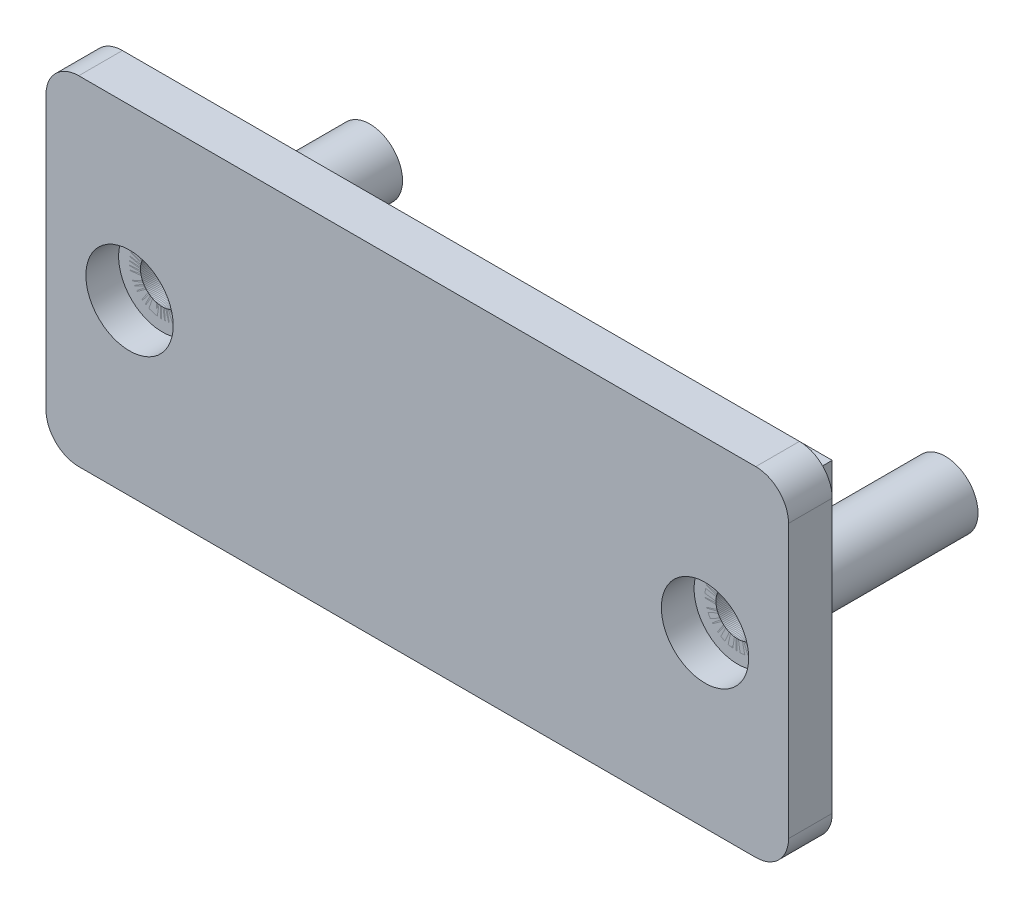
ISO-10303-21;
HEADER;
FILE_DESCRIPTION(('STEP AP214'),'2;1');
FILE_NAME('part.step','',(''),(''),'','','');
FILE_SCHEMA(('AUTOMOTIVE_DESIGN { 1 0 10303 214 1 1 1 1 }'));
ENDSEC;
DATA;
#1=APPLICATION_CONTEXT('core data for automotive mechanical design processes');
#2=APPLICATION_PROTOCOL_DEFINITION('international standard','automotive_design',2000,#1);
#3=PRODUCT_CONTEXT('',#1,'mechanical');
#4=PRODUCT('Part','Part','',(#3));
#5=PRODUCT_RELATED_PRODUCT_CATEGORY('part','',(#4));
#6=PRODUCT_DEFINITION_FORMATION('','',#4);
#7=PRODUCT_DEFINITION_CONTEXT('part definition',#1,'design');
#8=PRODUCT_DEFINITION('design','',#6,#7);
#9=PRODUCT_DEFINITION_SHAPE('','',#8);
#10=(LENGTH_UNIT() NAMED_UNIT(*) SI_UNIT(.MILLI.,.METRE.));
#11=(NAMED_UNIT(*) PLANE_ANGLE_UNIT() SI_UNIT($,.RADIAN.));
#12=(NAMED_UNIT(*) SI_UNIT($,.STERADIAN.) SOLID_ANGLE_UNIT());
#13=UNCERTAINTY_MEASURE_WITH_UNIT(LENGTH_MEASURE(1.E-05),#10,'distance_accuracy_value','');
#14=(GEOMETRIC_REPRESENTATION_CONTEXT(3) GLOBAL_UNCERTAINTY_ASSIGNED_CONTEXT((#13)) GLOBAL_UNIT_ASSIGNED_CONTEXT((#10,
#11,#12)) REPRESENTATION_CONTEXT('',''));
#15=CARTESIAN_POINT('',(0.,0.,0.));
#16=DIRECTION('',(0.,0.,1.));
#17=DIRECTION('',(1.,0.,0.));
#18=AXIS2_PLACEMENT_3D('',#15,#16,#17);
#19=CARTESIAN_POINT('',(-26.35,0.,26.));
#20=DIRECTION('',(0.,0.,-1.));
#21=DIRECTION('',(-1.,0.,0.));
#22=AXIS2_PLACEMENT_3D('',#19,#20,#21);
#23=CYLINDRICAL_SURFACE('',#22,2.);
#24=CARTESIAN_POINT('',(-26.35,0.,-8.));
#25=DIRECTION('',(0.,0.,1.));
#26=DIRECTION('',(1.,0.,0.));
#27=AXIS2_PLACEMENT_3D('',#24,#25,#26);
#28=CIRCLE('',#27,2.);
#29=CARTESIAN_POINT('',(-28.35,0.,-8.));
#30=VERTEX_POINT('',#29);
#31=EDGE_CURVE('E196',#30,#30,#28,.F.);
#32=CARTESIAN_POINT('',(-26.35,0.,-3.));
#33=DIRECTION('',(0.,0.,1.));
#34=DIRECTION('',(1.,0.,0.));
#35=AXIS2_PLACEMENT_3D('',#32,#33,#34);
#36=CIRCLE('',#35,2.);
#37=CARTESIAN_POINT('',(-28.35,0.,-3.));
#38=VERTEX_POINT('',#37);
#39=EDGE_CURVE('E302',#38,#38,#36,.T.);
#40=CARTESIAN_POINT('',(-28.35,0.,-8.));
#41=CARTESIAN_POINT('',(-28.35,0.,-7.94791666666667));
#42=CARTESIAN_POINT('',(-28.35,0.,-7.89583333333334));
#43=CARTESIAN_POINT('',(-28.35,0.,-7.79166666666667));
#44=CARTESIAN_POINT('',(-28.35,0.,-7.73958333333333));
#45=CARTESIAN_POINT('',(-28.35,0.,-7.63541666666667));
#46=CARTESIAN_POINT('',(-28.35,0.,-7.58333333333333));
#47=CARTESIAN_POINT('',(-28.35,0.,-7.47916666666666));
#48=CARTESIAN_POINT('',(-28.35,0.,-7.42708333333333));
#49=CARTESIAN_POINT('',(-28.35,0.,-7.32291666666667));
#50=CARTESIAN_POINT('',(-28.35,0.,-7.27083333333333));
#51=CARTESIAN_POINT('',(-28.35,0.,-7.16666666666667));
#52=CARTESIAN_POINT('',(-28.35,0.,-7.11458333333333));
#53=CARTESIAN_POINT('',(-28.35,0.,-7.01041666666667));
#54=CARTESIAN_POINT('',(-28.35,0.,-6.95833333333333));
#55=CARTESIAN_POINT('',(-28.35,0.,-6.85416666666666));
#56=CARTESIAN_POINT('',(-28.35,0.,-6.80208333333333));
#57=CARTESIAN_POINT('',(-28.35,0.,-6.69791666666667));
#58=CARTESIAN_POINT('',(-28.35,0.,-6.64583333333333));
#59=CARTESIAN_POINT('',(-28.35,0.,-6.54166666666667));
#60=CARTESIAN_POINT('',(-28.35,0.,-6.48958333333333));
#61=CARTESIAN_POINT('',(-28.35,0.,-6.38541666666666));
#62=CARTESIAN_POINT('',(-28.35,0.,-6.33333333333333));
#63=CARTESIAN_POINT('',(-28.35,0.,-6.22916666666666));
#64=CARTESIAN_POINT('',(-28.35,0.,-6.17708333333333));
#65=CARTESIAN_POINT('',(-28.35,0.,-6.07291666666667));
#66=CARTESIAN_POINT('',(-28.35,0.,-6.02083333333333));
#67=CARTESIAN_POINT('',(-28.35,0.,-5.91666666666667));
#68=CARTESIAN_POINT('',(-28.35,0.,-5.86458333333333));
#69=CARTESIAN_POINT('',(-28.35,0.,-5.76041666666666));
#70=CARTESIAN_POINT('',(-28.35,0.,-5.70833333333333));
#71=CARTESIAN_POINT('',(-28.35,0.,-5.60416666666666));
#72=CARTESIAN_POINT('',(-28.35,0.,-5.55208333333333));
#73=CARTESIAN_POINT('',(-28.35,0.,-5.44791666666667));
#74=CARTESIAN_POINT('',(-28.35,0.,-5.39583333333333));
#75=CARTESIAN_POINT('',(-28.35,0.,-5.29166666666667));
#76=CARTESIAN_POINT('',(-28.35,0.,-5.23958333333333));
#77=CARTESIAN_POINT('',(-28.35,0.,-5.13541666666667));
#78=CARTESIAN_POINT('',(-28.35,0.,-5.08333333333333));
#79=CARTESIAN_POINT('',(-28.35,0.,-4.97916666666667));
#80=CARTESIAN_POINT('',(-28.35,0.,-4.92708333333333));
#81=CARTESIAN_POINT('',(-28.35,0.,-4.82291666666667));
#82=CARTESIAN_POINT('',(-28.35,0.,-4.77083333333333));
#83=CARTESIAN_POINT('',(-28.35,0.,-4.66666666666667));
#84=CARTESIAN_POINT('',(-28.35,0.,-4.61458333333333));
#85=CARTESIAN_POINT('',(-28.35,0.,-4.51041666666667));
#86=CARTESIAN_POINT('',(-28.35,0.,-4.45833333333333));
#87=CARTESIAN_POINT('',(-28.35,0.,-4.35416666666667));
#88=CARTESIAN_POINT('',(-28.35,0.,-4.30208333333333));
#89=CARTESIAN_POINT('',(-28.35,0.,-4.19791666666667));
#90=CARTESIAN_POINT('',(-28.35,0.,-4.14583333333333));
#91=CARTESIAN_POINT('',(-28.35,0.,-4.04166666666667));
#92=CARTESIAN_POINT('',(-28.35,0.,-3.98958333333333));
#93=CARTESIAN_POINT('',(-28.35,0.,-3.88541666666667));
#94=CARTESIAN_POINT('',(-28.35,0.,-3.83333333333333));
#95=CARTESIAN_POINT('',(-28.35,0.,-3.72916666666667));
#96=CARTESIAN_POINT('',(-28.35,0.,-3.67708333333333));
#97=CARTESIAN_POINT('',(-28.35,0.,-3.57291666666667));
#98=CARTESIAN_POINT('',(-28.35,0.,-3.52083333333333));
#99=CARTESIAN_POINT('',(-28.35,0.,-3.41666666666667));
#100=CARTESIAN_POINT('',(-28.35,0.,-3.36458333333333));
#101=CARTESIAN_POINT('',(-28.35,0.,-3.26041666666667));
#102=CARTESIAN_POINT('',(-28.35,0.,-3.20833333333333));
#103=CARTESIAN_POINT('',(-28.35,0.,-3.10416666666667));
#104=CARTESIAN_POINT('',(-28.35,0.,-3.05208333333333));
#105=CARTESIAN_POINT('',(-28.35,0.,-3.));
#106=B_SPLINE_CURVE_WITH_KNOTS('',3,(#40,#41,#42,#43,#44,#45,#46,#47,#48,#49,#50,#51,#52,#53,
#54,#55,#56,#57,#58,#59,#60,#61,#62,#63,#64,#65,#66,#67,#68,#69,#70,#71,#72,#73,#74,#75,#76,#77,
#78,#79,#80,#81,#82,#83,#84,#85,#86,#87,#88,#89,#90,#91,#92,#93,#94,#95,#96,#97,#98,#99,#100,
#101,#102,#103,#104,#105),.UNSPECIFIED.,.F.,.F.,(4,2,2,2,2,2,2,2,2,2,2,2,2,2,2,2,2,2,2,2,2,2,2,
2,2,2,2,2,2,2,2,2,4),(0.,0.156249999999997,0.3125,0.468750000000004,0.625000000000001,
0.781249999999997,0.937500000000001,1.09375,1.25,1.40625,1.5625,1.71875,1.875,2.03125,2.1875,
2.34375000000001,2.5,2.65625,2.8125,2.96875,3.125,3.28125,3.4375,3.59375,3.75,3.90625,4.0625,
4.21875,4.375,4.53125,4.6875,4.84375,5.),.UNSPECIFIED.);
#107=EDGE_CURVE('BSEAM80',#30,#38,#106,.T.);
#108=ORIENTED_EDGE('',*,*,#31,.T.);
#109=ORIENTED_EDGE('',*,*,#39,.T.);
#110=ORIENTED_EDGE('',*,*,#107,.T.);
#111=ORIENTED_EDGE('',*,*,#107,.F.);
#112=EDGE_LOOP('',(#108,#110,#109,#111));
#113=FACE_BOUND('',#112,.T.);
#114=ADVANCED_FACE('F80',(#113),#23,.F.);
#115=CARTESIAN_POINT('',(26.35,0.,26.));
#116=DIRECTION('',(0.,0.,-1.));
#117=DIRECTION('',(-1.,0.,0.));
#118=AXIS2_PLACEMENT_3D('',#115,#116,#117);
#119=CYLINDRICAL_SURFACE('',#118,2.);
#120=CARTESIAN_POINT('',(26.35,0.,-8.));
#121=DIRECTION('',(0.,0.,1.));
#122=DIRECTION('',(1.,0.,0.));
#123=AXIS2_PLACEMENT_3D('',#120,#121,#122);
#124=CIRCLE('',#123,2.);
#125=CARTESIAN_POINT('',(24.35,0.,-8.));
#126=VERTEX_POINT('',#125);
#127=EDGE_CURVE('E84',#126,#126,#124,.F.);
#128=CARTESIAN_POINT('',(26.35,0.,-3.));
#129=DIRECTION('',(0.,0.,1.));
#130=DIRECTION('',(1.,0.,0.));
#131=AXIS2_PLACEMENT_3D('',#128,#129,#130);
#132=CIRCLE('',#131,2.);
#133=CARTESIAN_POINT('',(24.35,0.,-3.));
#134=VERTEX_POINT('',#133);
#135=EDGE_CURVE('E299',#134,#134,#132,.T.);
#136=CARTESIAN_POINT('',(24.35,0.,-8.));
#137=CARTESIAN_POINT('',(24.35,0.,-7.94791666666667));
#138=CARTESIAN_POINT('',(24.35,0.,-7.89583333333334));
#139=CARTESIAN_POINT('',(24.35,0.,-7.79166666666667));
#140=CARTESIAN_POINT('',(24.35,0.,-7.73958333333333));
#141=CARTESIAN_POINT('',(24.35,0.,-7.63541666666667));
#142=CARTESIAN_POINT('',(24.35,0.,-7.58333333333333));
#143=CARTESIAN_POINT('',(24.35,0.,-7.47916666666666));
#144=CARTESIAN_POINT('',(24.35,0.,-7.42708333333333));
#145=CARTESIAN_POINT('',(24.35,0.,-7.32291666666667));
#146=CARTESIAN_POINT('',(24.35,0.,-7.27083333333333));
#147=CARTESIAN_POINT('',(24.35,0.,-7.16666666666667));
#148=CARTESIAN_POINT('',(24.35,0.,-7.11458333333333));
#149=CARTESIAN_POINT('',(24.35,0.,-7.01041666666667));
#150=CARTESIAN_POINT('',(24.35,0.,-6.95833333333333));
#151=CARTESIAN_POINT('',(24.35,0.,-6.85416666666666));
#152=CARTESIAN_POINT('',(24.35,0.,-6.80208333333333));
#153=CARTESIAN_POINT('',(24.35,0.,-6.69791666666667));
#154=CARTESIAN_POINT('',(24.35,0.,-6.64583333333333));
#155=CARTESIAN_POINT('',(24.35,0.,-6.54166666666667));
#156=CARTESIAN_POINT('',(24.35,0.,-6.48958333333333));
#157=CARTESIAN_POINT('',(24.35,0.,-6.38541666666666));
#158=CARTESIAN_POINT('',(24.35,0.,-6.33333333333333));
#159=CARTESIAN_POINT('',(24.35,0.,-6.22916666666666));
#160=CARTESIAN_POINT('',(24.35,0.,-6.17708333333333));
#161=CARTESIAN_POINT('',(24.35,0.,-6.07291666666667));
#162=CARTESIAN_POINT('',(24.35,0.,-6.02083333333333));
#163=CARTESIAN_POINT('',(24.35,0.,-5.91666666666667));
#164=CARTESIAN_POINT('',(24.35,0.,-5.86458333333333));
#165=CARTESIAN_POINT('',(24.35,0.,-5.76041666666666));
#166=CARTESIAN_POINT('',(24.35,0.,-5.70833333333333));
#167=CARTESIAN_POINT('',(24.35,0.,-5.60416666666666));
#168=CARTESIAN_POINT('',(24.35,0.,-5.55208333333333));
#169=CARTESIAN_POINT('',(24.35,0.,-5.44791666666667));
#170=CARTESIAN_POINT('',(24.35,0.,-5.39583333333333));
#171=CARTESIAN_POINT('',(24.35,0.,-5.29166666666667));
#172=CARTESIAN_POINT('',(24.35,0.,-5.23958333333333));
#173=CARTESIAN_POINT('',(24.35,0.,-5.13541666666667));
#174=CARTESIAN_POINT('',(24.35,0.,-5.08333333333333));
#175=CARTESIAN_POINT('',(24.35,0.,-4.97916666666667));
#176=CARTESIAN_POINT('',(24.35,0.,-4.92708333333333));
#177=CARTESIAN_POINT('',(24.35,0.,-4.82291666666667));
#178=CARTESIAN_POINT('',(24.35,0.,-4.77083333333333));
#179=CARTESIAN_POINT('',(24.35,0.,-4.66666666666667));
#180=CARTESIAN_POINT('',(24.35,0.,-4.61458333333333));
#181=CARTESIAN_POINT('',(24.35,0.,-4.51041666666667));
#182=CARTESIAN_POINT('',(24.35,0.,-4.45833333333333));
#183=CARTESIAN_POINT('',(24.35,0.,-4.35416666666667));
#184=CARTESIAN_POINT('',(24.35,0.,-4.30208333333333));
#185=CARTESIAN_POINT('',(24.35,0.,-4.19791666666667));
#186=CARTESIAN_POINT('',(24.35,0.,-4.14583333333333));
#187=CARTESIAN_POINT('',(24.35,0.,-4.04166666666667));
#188=CARTESIAN_POINT('',(24.35,0.,-3.98958333333333));
#189=CARTESIAN_POINT('',(24.35,0.,-3.88541666666667));
#190=CARTESIAN_POINT('',(24.35,0.,-3.83333333333333));
#191=CARTESIAN_POINT('',(24.35,0.,-3.72916666666667));
#192=CARTESIAN_POINT('',(24.35,0.,-3.67708333333333));
#193=CARTESIAN_POINT('',(24.35,0.,-3.57291666666667));
#194=CARTESIAN_POINT('',(24.35,0.,-3.52083333333333));
#195=CARTESIAN_POINT('',(24.35,0.,-3.41666666666667));
#196=CARTESIAN_POINT('',(24.35,0.,-3.36458333333333));
#197=CARTESIAN_POINT('',(24.35,0.,-3.26041666666667));
#198=CARTESIAN_POINT('',(24.35,0.,-3.20833333333333));
#199=CARTESIAN_POINT('',(24.35,0.,-3.10416666666667));
#200=CARTESIAN_POINT('',(24.35,0.,-3.05208333333333));
#201=CARTESIAN_POINT('',(24.35,0.,-3.));
#202=B_SPLINE_CURVE_WITH_KNOTS('',3,(#136,#137,#138,#139,#140,#141,#142,#143,#144,#145,#146,
#147,#148,#149,#150,#151,#152,#153,#154,#155,#156,#157,#158,#159,#160,#161,#162,#163,#164,#165,
#166,#167,#168,#169,#170,#171,#172,#173,#174,#175,#176,#177,#178,#179,#180,#181,#182,#183,#184,
#185,#186,#187,#188,#189,#190,#191,#192,#193,#194,#195,#196,#197,#198,#199,#200,#201),
.UNSPECIFIED.,.F.,.F.,(4,2,2,2,2,2,2,2,2,2,2,2,2,2,2,2,2,2,2,2,2,2,2,2,2,2,2,2,2,2,2,2,4),(0.,
0.156249999999997,0.3125,0.468750000000004,0.625000000000001,0.781249999999997,
0.937500000000001,1.09375,1.25,1.40625,1.5625,1.71875,1.875,2.03125,2.1875,2.34375000000001,2.5,
2.65625,2.8125,2.96875,3.125,3.28125,3.4375,3.59375,3.75,3.90625,4.0625,4.21875,4.375,4.53125,
4.6875,4.84375,5.),.UNSPECIFIED.);
#203=EDGE_CURVE('BSEAM269',#126,#134,#202,.T.);
#204=ORIENTED_EDGE('',*,*,#127,.T.);
#205=ORIENTED_EDGE('',*,*,#135,.T.);
#206=ORIENTED_EDGE('',*,*,#203,.T.);
#207=ORIENTED_EDGE('',*,*,#203,.F.);
#208=EDGE_LOOP('',(#204,#206,#205,#207));
#209=FACE_BOUND('',#208,.T.);
#210=ADVANCED_FACE('F269',(#209),#119,.F.);
#211=CARTESIAN_POINT('',(-31.0000000000001,-12.5,-4.));
#212=DIRECTION('',(0.,0.,1.));
#213=DIRECTION('',(1.,0.,0.));
#214=AXIS2_PLACEMENT_3D('',#211,#212,#213);
#215=CYLINDRICAL_SURFACE('',#214,3.);
#216=CARTESIAN_POINT('',(-31.0000000000001,-12.5,0.));
#217=DIRECTION('',(0.,0.,1.));
#218=DIRECTION('',(1.,0.,0.));
#219=AXIS2_PLACEMENT_3D('',#216,#217,#218);
#220=CIRCLE('',#219,3.);
#221=CARTESIAN_POINT('',(-34.,-12.5,0.));
#222=VERTEX_POINT('',#221);
#223=CARTESIAN_POINT('',(-31.,-15.5,0.));
#224=VERTEX_POINT('',#223);
#225=EDGE_CURVE('E192',#222,#224,#220,.T.);
#226=ORIENTED_EDGE('',*,*,#225,.F.);
#227=DIRECTION('',(0.,0.,1.));
#228=VECTOR('',#227,1.);
#229=CARTESIAN_POINT('',(-34.,-12.5,-4.));
#230=LINE('',#229,#228);
#231=CARTESIAN_POINT('',(-34.,-12.5,-4.));
#232=VERTEX_POINT('',#231);
#233=EDGE_CURVE('E13',#232,#222,#230,.T.);
#234=ORIENTED_EDGE('',*,*,#233,.F.);
#235=CARTESIAN_POINT('',(-31.0000000000001,-12.5,-4.));
#236=DIRECTION('',(0.,0.,1.));
#237=DIRECTION('',(1.,0.,0.));
#238=AXIS2_PLACEMENT_3D('',#235,#236,#237);
#239=CIRCLE('',#238,3.);
#240=CARTESIAN_POINT('',(-31.,-15.5,-4.));
#241=VERTEX_POINT('',#240);
#242=EDGE_CURVE('E213',#232,#241,#239,.T.);
#243=ORIENTED_EDGE('',*,*,#242,.T.);
#244=DIRECTION('',(0.,0.,1.));
#245=VECTOR('',#244,1.);
#246=CARTESIAN_POINT('',(-31.,-15.5,-4.));
#247=LINE('',#246,#245);
#248=EDGE_CURVE('E143',#241,#224,#247,.T.);
#249=ORIENTED_EDGE('',*,*,#248,.T.);
#250=EDGE_LOOP('',(#226,#234,#243,#249));
#251=FACE_BOUND('',#250,.T.);
#252=ADVANCED_FACE('F82',(#251),#215,.T.);
#253=CARTESIAN_POINT('',(-34.,12.5,-4.));
#254=DIRECTION('',(-1.,0.,0.));
#255=DIRECTION('',(0.,0.,1.));
#256=AXIS2_PLACEMENT_3D('',#253,#254,#255);
#257=PLANE('',#256);
#258=DIRECTION('',(0.,-1.,0.));
#259=VECTOR('',#258,1.);
#260=CARTESIAN_POINT('',(-34.,12.5,0.));
#261=LINE('',#260,#259);
#262=CARTESIAN_POINT('',(-34.,12.5,0.));
#263=VERTEX_POINT('',#262);
#264=EDGE_CURVE('E211',#263,#222,#261,.T.);
#265=ORIENTED_EDGE('',*,*,#264,.F.);
#266=DIRECTION('',(0.,0.,1.));
#267=VECTOR('',#266,1.);
#268=CARTESIAN_POINT('',(-34.,12.5,-4.));
#269=LINE('',#268,#267);
#270=CARTESIAN_POINT('',(-34.,12.5,-4.));
#271=VERTEX_POINT('',#270);
#272=EDGE_CURVE('E89',#271,#263,#269,.T.);
#273=ORIENTED_EDGE('',*,*,#272,.F.);
#274=DIRECTION('',(0.,-1.,0.));
#275=VECTOR('',#274,1.);
#276=CARTESIAN_POINT('',(-34.,12.5,-4.));
#277=LINE('',#276,#275);
#278=EDGE_CURVE('E182',#271,#232,#277,.T.);
#279=ORIENTED_EDGE('',*,*,#278,.T.);
#280=ORIENTED_EDGE('',*,*,#233,.T.);
#281=EDGE_LOOP('',(#265,#273,#279,#280));
#282=FACE_BOUND('',#281,.T.);
#283=ADVANCED_FACE('F261',(#282),#257,.T.);
#284=CARTESIAN_POINT('',(-31.0000000000001,12.5,-4.));
#285=DIRECTION('',(0.,0.,1.));
#286=DIRECTION('',(1.,0.,0.));
#287=AXIS2_PLACEMENT_3D('',#284,#285,#286);
#288=CYLINDRICAL_SURFACE('',#287,3.);
#289=CARTESIAN_POINT('',(-31.0000000000001,12.5,0.));
#290=DIRECTION('',(0.,0.,1.));
#291=DIRECTION('',(-1.,0.,0.));
#292=AXIS2_PLACEMENT_3D('',#289,#290,#291);
#293=CIRCLE('',#292,3.);
#294=CARTESIAN_POINT('',(-31.,15.5,0.));
#295=VERTEX_POINT('',#294);
#296=EDGE_CURVE('E168',#295,#263,#293,.T.);
#297=ORIENTED_EDGE('',*,*,#296,.F.);
#298=DIRECTION('',(0.,0.,1.));
#299=VECTOR('',#298,1.);
#300=CARTESIAN_POINT('',(-31.,15.5,-4.));
#301=LINE('',#300,#299);
#302=CARTESIAN_POINT('',(-31.,15.5,-4.));
#303=VERTEX_POINT('',#302);
#304=EDGE_CURVE('E162',#303,#295,#301,.T.);
#305=ORIENTED_EDGE('',*,*,#304,.F.);
#306=CARTESIAN_POINT('',(-31.0000000000001,12.5,-4.));
#307=DIRECTION('',(0.,0.,1.));
#308=DIRECTION('',(-1.,0.,0.));
#309=AXIS2_PLACEMENT_3D('',#306,#307,#308);
#310=CIRCLE('',#309,3.);
#311=EDGE_CURVE('E165',#303,#271,#310,.T.);
#312=ORIENTED_EDGE('',*,*,#311,.T.);
#313=ORIENTED_EDGE('',*,*,#272,.T.);
#314=EDGE_LOOP('',(#297,#305,#312,#313));
#315=FACE_BOUND('',#314,.T.);
#316=ADVANCED_FACE('F164',(#315),#288,.T.);
#317=CARTESIAN_POINT('',(-31.,15.5,-4.));
#318=DIRECTION('',(0.,1.,0.));
#319=DIRECTION('',(0.,0.,1.));
#320=AXIS2_PLACEMENT_3D('',#317,#318,#319);
#321=PLANE('',#320);
#322=DIRECTION('',(-1.,0.,0.));
#323=VECTOR('',#322,1.);
#324=CARTESIAN_POINT('',(-31.,15.5,0.));
#325=LINE('',#324,#323);
#326=CARTESIAN_POINT('',(31.,15.5,0.));
#327=VERTEX_POINT('',#326);
#328=EDGE_CURVE('E208',#327,#295,#325,.T.);
#329=ORIENTED_EDGE('',*,*,#328,.F.);
#330=DIRECTION('',(0.,0.,1.));
#331=VECTOR('',#330,1.);
#332=CARTESIAN_POINT('',(31.,15.5,-4.));
#333=LINE('',#332,#331);
#334=CARTESIAN_POINT('',(31.,15.5,-4.));
#335=VERTEX_POINT('',#334);
#336=EDGE_CURVE('E173',#335,#327,#333,.T.);
#337=ORIENTED_EDGE('',*,*,#336,.F.);
#338=DIRECTION('',(-1.,0.,0.));
#339=VECTOR('',#338,1.);
#340=CARTESIAN_POINT('',(-31.,15.5,-4.));
#341=LINE('',#340,#339);
#342=EDGE_CURVE('E180',#335,#303,#341,.T.);
#343=ORIENTED_EDGE('',*,*,#342,.T.);
#344=ORIENTED_EDGE('',*,*,#304,.T.);
#345=EDGE_LOOP('',(#329,#337,#343,#344));
#346=FACE_BOUND('',#345,.T.);
#347=ADVANCED_FACE('F184',(#346),#321,.T.);
#348=CARTESIAN_POINT('',(31.,12.5,-4.));
#349=DIRECTION('',(0.,0.,1.));
#350=DIRECTION('',(1.,0.,0.));
#351=AXIS2_PLACEMENT_3D('',#348,#349,#350);
#352=CYLINDRICAL_SURFACE('',#351,3.);
#353=CARTESIAN_POINT('',(31.,12.5,0.));
#354=DIRECTION('',(0.,0.,1.));
#355=DIRECTION('',(1.,0.,0.));
#356=AXIS2_PLACEMENT_3D('',#353,#354,#355);
#357=CIRCLE('',#356,3.);
#358=CARTESIAN_POINT('',(34.,12.5,0.));
#359=VERTEX_POINT('',#358);
#360=EDGE_CURVE('E205',#359,#327,#357,.T.);
#361=ORIENTED_EDGE('',*,*,#360,.F.);
#362=DIRECTION('',(0.,0.,1.));
#363=VECTOR('',#362,1.);
#364=CARTESIAN_POINT('',(34.,12.5,-4.));
#365=LINE('',#364,#363);
#366=CARTESIAN_POINT('',(34.,12.5,-4.));
#367=VERTEX_POINT('',#366);
#368=EDGE_CURVE('E217',#367,#359,#365,.T.);
#369=ORIENTED_EDGE('',*,*,#368,.F.);
#370=CARTESIAN_POINT('',(31.,12.5,-4.));
#371=DIRECTION('',(0.,0.,1.));
#372=DIRECTION('',(1.,0.,0.));
#373=AXIS2_PLACEMENT_3D('',#370,#371,#372);
#374=CIRCLE('',#373,3.);
#375=EDGE_CURVE('E185',#367,#335,#374,.T.);
#376=ORIENTED_EDGE('',*,*,#375,.T.);
#377=ORIENTED_EDGE('',*,*,#336,.T.);
#378=EDGE_LOOP('',(#361,#369,#376,#377));
#379=FACE_BOUND('',#378,.T.);
#380=ADVANCED_FACE('F588',(#379),#352,.T.);
#381=CARTESIAN_POINT('',(34.,12.5,-4.));
#382=DIRECTION('',(1.,0.,0.));
#383=DIRECTION('',(0.,0.,-1.));
#384=AXIS2_PLACEMENT_3D('',#381,#382,#383);
#385=PLANE('',#384);
#386=DIRECTION('',(0.,1.,0.));
#387=VECTOR('',#386,1.);
#388=CARTESIAN_POINT('',(34.,12.5,0.));
#389=LINE('',#388,#387);
#390=CARTESIAN_POINT('',(34.,-12.5,0.));
#391=VERTEX_POINT('',#390);
#392=EDGE_CURVE('E202',#391,#359,#389,.T.);
#393=ORIENTED_EDGE('',*,*,#392,.F.);
#394=DIRECTION('',(0.,0.,1.));
#395=VECTOR('',#394,1.);
#396=CARTESIAN_POINT('',(34.,-12.5,-4.));
#397=LINE('',#396,#395);
#398=CARTESIAN_POINT('',(34.,-12.5,-4.));
#399=VERTEX_POINT('',#398);
#400=EDGE_CURVE('E219',#399,#391,#397,.T.);
#401=ORIENTED_EDGE('',*,*,#400,.F.);
#402=DIRECTION('',(0.,1.,0.));
#403=VECTOR('',#402,1.);
#404=CARTESIAN_POINT('',(34.,12.5,-4.));
#405=LINE('',#404,#403);
#406=EDGE_CURVE('E187',#399,#367,#405,.T.);
#407=ORIENTED_EDGE('',*,*,#406,.T.);
#408=ORIENTED_EDGE('',*,*,#368,.T.);
#409=EDGE_LOOP('',(#393,#401,#407,#408));
#410=FACE_BOUND('',#409,.T.);
#411=ADVANCED_FACE('F252',(#410),#385,.T.);
#412=CARTESIAN_POINT('',(31.,-12.5,-4.));
#413=DIRECTION('',(0.,0.,1.));
#414=DIRECTION('',(1.,0.,0.));
#415=AXIS2_PLACEMENT_3D('',#412,#413,#414);
#416=CYLINDRICAL_SURFACE('',#415,3.);
#417=CARTESIAN_POINT('',(31.,-12.5,0.));
#418=DIRECTION('',(0.,0.,1.));
#419=DIRECTION('',(1.,0.,0.));
#420=AXIS2_PLACEMENT_3D('',#417,#418,#419);
#421=CIRCLE('',#420,3.);
#422=CARTESIAN_POINT('',(31.,-15.5,0.));
#423=VERTEX_POINT('',#422);
#424=EDGE_CURVE('E199',#423,#391,#421,.T.);
#425=ORIENTED_EDGE('',*,*,#424,.F.);
#426=DIRECTION('',(0.,0.,1.));
#427=VECTOR('',#426,1.);
#428=CARTESIAN_POINT('',(31.,-15.5,-4.));
#429=LINE('',#428,#427);
#430=CARTESIAN_POINT('',(31.,-15.5,-4.));
#431=VERTEX_POINT('',#430);
#432=EDGE_CURVE('E221',#431,#423,#429,.T.);
#433=ORIENTED_EDGE('',*,*,#432,.F.);
#434=CARTESIAN_POINT('',(31.,-12.5,-4.));
#435=DIRECTION('',(0.,0.,1.));
#436=DIRECTION('',(1.,0.,0.));
#437=AXIS2_PLACEMENT_3D('',#434,#435,#436);
#438=CIRCLE('',#437,3.);
#439=EDGE_CURVE('E246',#431,#399,#438,.T.);
#440=ORIENTED_EDGE('',*,*,#439,.T.);
#441=ORIENTED_EDGE('',*,*,#400,.T.);
#442=EDGE_LOOP('',(#425,#433,#440,#441));
#443=FACE_BOUND('',#442,.T.);
#444=ADVANCED_FACE('F257',(#443),#416,.T.);
#445=CARTESIAN_POINT('',(-31.,-15.5,-4.));
#446=DIRECTION('',(0.,-1.,0.));
#447=DIRECTION('',(0.,0.,-1.));
#448=AXIS2_PLACEMENT_3D('',#445,#446,#447);
#449=PLANE('',#448);
#450=DIRECTION('',(1.,0.,0.));
#451=VECTOR('',#450,1.);
#452=CARTESIAN_POINT('',(-31.,-15.5,0.));
#453=LINE('',#452,#451);
#454=EDGE_CURVE('E195',#224,#423,#453,.T.);
#455=ORIENTED_EDGE('',*,*,#454,.F.);
#456=ORIENTED_EDGE('',*,*,#248,.F.);
#457=DIRECTION('',(1.,0.,0.));
#458=VECTOR('',#457,1.);
#459=CARTESIAN_POINT('',(-31.,-15.5,-4.));
#460=LINE('',#459,#458);
#461=EDGE_CURVE('E244',#241,#431,#460,.T.);
#462=ORIENTED_EDGE('',*,*,#461,.T.);
#463=ORIENTED_EDGE('',*,*,#432,.T.);
#464=EDGE_LOOP('',(#455,#456,#462,#463));
#465=FACE_BOUND('',#464,.T.);
#466=ADVANCED_FACE('F258',(#465),#449,.T.);
#467=CARTESIAN_POINT('',(-31.0000000000001,-12.5,-4.));
#468=DIRECTION('',(0.,0.,1.));
#469=DIRECTION('',(1.,0.,0.));
#470=AXIS2_PLACEMENT_3D('',#467,#468,#469);
#471=PLANE('',#470);
#472=ORIENTED_EDGE('',*,*,#242,.F.);
#473=ORIENTED_EDGE('',*,*,#278,.F.);
#474=ORIENTED_EDGE('',*,*,#311,.F.);
#475=ORIENTED_EDGE('',*,*,#342,.F.);
#476=ORIENTED_EDGE('',*,*,#375,.F.);
#477=ORIENTED_EDGE('',*,*,#406,.F.);
#478=ORIENTED_EDGE('',*,*,#439,.F.);
#479=ORIENTED_EDGE('',*,*,#461,.F.);
#480=EDGE_LOOP('',(#472,#473,#474,#475,#476,#477,#478,#479));
#481=FACE_BOUND('',#480,.T.);
#482=DIRECTION('',(1.,0.,0.));
#483=VECTOR('',#482,1.);
#484=CARTESIAN_POINT('',(-30.,-11.5,-4.));
#485=LINE('',#484,#483);
#486=CARTESIAN_POINT('',(-30.,-11.5,-4.));
#487=VERTEX_POINT('',#486);
#488=CARTESIAN_POINT('',(30.,-11.5,-4.));
#489=VERTEX_POINT('',#488);
#490=EDGE_CURVE('E309',#487,#489,#485,.T.);
#491=ORIENTED_EDGE('',*,*,#490,.T.);
#492=DIRECTION('',(0.,1.,0.));
#493=VECTOR('',#492,1.);
#494=CARTESIAN_POINT('',(30.,-11.5,-4.));
#495=LINE('',#494,#493);
#496=CARTESIAN_POINT('',(30.,11.5,-4.));
#497=VERTEX_POINT('',#496);
#498=EDGE_CURVE('E348',#489,#497,#495,.T.);
#499=ORIENTED_EDGE('',*,*,#498,.T.);
#500=DIRECTION('',(1.,0.,0.));
#501=VECTOR('',#500,1.);
#502=CARTESIAN_POINT('',(7.99999999999998,11.5,-4.));
#503=LINE('',#502,#501);
#504=CARTESIAN_POINT('',(7.99999999999998,11.5,-4.));
#505=VERTEX_POINT('',#504);
#506=EDGE_CURVE('E345',#505,#497,#503,.T.);
#507=ORIENTED_EDGE('',*,*,#506,.F.);
#508=DIRECTION('',(0.,1.,0.));
#509=VECTOR('',#508,1.);
#510=CARTESIAN_POINT('',(7.99999999999998,-4.49999999999998,-4.));
#511=LINE('',#510,#509);
#512=CARTESIAN_POINT('',(7.99999999999998,-4.49999999999998,-4.));
#513=VERTEX_POINT('',#512);
#514=EDGE_CURVE('E342',#513,#505,#511,.T.);
#515=ORIENTED_EDGE('',*,*,#514,.F.);
#516=DIRECTION('',(1.,0.,0.));
#517=VECTOR('',#516,1.);
#518=CARTESIAN_POINT('',(-8.00000000000002,-4.49999999999998,-4.));
#519=LINE('',#518,#517);
#520=CARTESIAN_POINT('',(-8.00000000000002,-4.49999999999998,-4.));
#521=VERTEX_POINT('',#520);
#522=EDGE_CURVE('E339',#521,#513,#519,.T.);
#523=ORIENTED_EDGE('',*,*,#522,.F.);
#524=DIRECTION('',(0.,-1.,0.));
#525=VECTOR('',#524,1.);
#526=CARTESIAN_POINT('',(-8.00000000000002,11.5,-4.));
#527=LINE('',#526,#525);
#528=CARTESIAN_POINT('',(-8.00000000000002,11.5,-4.));
#529=VERTEX_POINT('',#528);
#530=EDGE_CURVE('E336',#529,#521,#527,.T.);
#531=ORIENTED_EDGE('',*,*,#530,.F.);
#532=DIRECTION('',(1.,0.,0.));
#533=VECTOR('',#532,1.);
#534=CARTESIAN_POINT('',(-30.,11.5,-4.));
#535=LINE('',#534,#533);
#536=CARTESIAN_POINT('',(-30.,11.5,-4.));
#537=VERTEX_POINT('',#536);
#538=EDGE_CURVE('E333',#537,#529,#535,.T.);
#539=ORIENTED_EDGE('',*,*,#538,.F.);
#540=DIRECTION('',(0.,1.,0.));
#541=VECTOR('',#540,1.);
#542=CARTESIAN_POINT('',(-30.,-11.5,-4.));
#543=LINE('',#542,#541);
#544=EDGE_CURVE('E331',#487,#537,#543,.T.);
#545=ORIENTED_EDGE('',*,*,#544,.F.);
#546=EDGE_LOOP('',(#491,#499,#507,#515,#523,#531,#539,#545));
#547=FACE_BOUND('',#546,.T.);
#548=ADVANCED_FACE('F177',(#481,#547),#471,.F.);
#549=CARTESIAN_POINT('',(-31.0000000000001,-12.5,0.));
#550=DIRECTION('',(0.,0.,1.));
#551=DIRECTION('',(1.,0.,0.));
#552=AXIS2_PLACEMENT_3D('',#549,#550,#551);
#553=PLANE('',#552);
#554=CARTESIAN_POINT('',(-26.35,0.,0.));
#555=DIRECTION('',(0.,0.,1.));
#556=DIRECTION('',(1.,0.,0.));
#557=AXIS2_PLACEMENT_3D('',#554,#555,#556);
#558=CIRCLE('',#557,4.);
#559=CARTESIAN_POINT('',(-22.35,0.,0.));
#560=VERTEX_POINT('',#559);
#561=EDGE_CURVE('E293',#560,#560,#558,.T.);
#562=ORIENTED_EDGE('',*,*,#561,.F.);
#563=EDGE_LOOP('',(#562));
#564=FACE_BOUND('',#563,.T.);
#565=CARTESIAN_POINT('',(26.35,0.,0.));
#566=DIRECTION('',(0.,0.,1.));
#567=DIRECTION('',(1.,0.,0.));
#568=AXIS2_PLACEMENT_3D('',#565,#566,#567);
#569=CIRCLE('',#568,4.);
#570=CARTESIAN_POINT('',(30.35,0.,0.));
#571=VERTEX_POINT('',#570);
#572=EDGE_CURVE('E296',#571,#571,#569,.T.);
#573=ORIENTED_EDGE('',*,*,#572,.F.);
#574=EDGE_LOOP('',(#573));
#575=FACE_BOUND('',#574,.T.);
#576=ORIENTED_EDGE('',*,*,#225,.T.);
#577=ORIENTED_EDGE('',*,*,#454,.T.);
#578=ORIENTED_EDGE('',*,*,#424,.T.);
#579=ORIENTED_EDGE('',*,*,#392,.T.);
#580=ORIENTED_EDGE('',*,*,#360,.T.);
#581=ORIENTED_EDGE('',*,*,#328,.T.);
#582=ORIENTED_EDGE('',*,*,#296,.T.);
#583=ORIENTED_EDGE('',*,*,#264,.T.);
#584=EDGE_LOOP('',(#576,#577,#578,#579,#580,#581,#582,#583));
#585=FACE_BOUND('',#584,.T.);
#586=ADVANCED_FACE('F260',(#564,#575,#585),#553,.T.);
#587=CARTESIAN_POINT('',(0.,0.,-8.));
#588=DIRECTION('',(0.,0.,1.));
#589=DIRECTION('',(1.,0.,0.));
#590=AXIS2_PLACEMENT_3D('',#587,#588,#589);
#591=PLANE('',#590);
#592=DIRECTION('',(1.,0.,0.));
#593=VECTOR('',#592,1.);
#594=CARTESIAN_POINT('',(-30.,-11.5,-8.));
#595=LINE('',#594,#593);
#596=CARTESIAN_POINT('',(-30.,-11.5,-8.));
#597=VERTEX_POINT('',#596);
#598=CARTESIAN_POINT('',(30.,-11.5,-8.));
#599=VERTEX_POINT('',#598);
#600=EDGE_CURVE('E327',#597,#599,#595,.T.);
#601=ORIENTED_EDGE('',*,*,#600,.F.);
#602=DIRECTION('',(0.,1.,0.));
#603=VECTOR('',#602,1.);
#604=CARTESIAN_POINT('',(-30.,-11.5,-8.));
#605=LINE('',#604,#603);
#606=CARTESIAN_POINT('',(-30.,11.5,-8.));
#607=VERTEX_POINT('',#606);
#608=EDGE_CURVE('E97',#597,#607,#605,.T.);
#609=ORIENTED_EDGE('',*,*,#608,.T.);
#610=DIRECTION('',(1.,0.,0.));
#611=VECTOR('',#610,1.);
#612=CARTESIAN_POINT('',(-30.,11.5,-8.));
#613=LINE('',#612,#611);
#614=CARTESIAN_POINT('',(-8.00000000000002,11.5,-8.));
#615=VERTEX_POINT('',#614);
#616=EDGE_CURVE('E308',#607,#615,#613,.T.);
#617=ORIENTED_EDGE('',*,*,#616,.T.);
#618=DIRECTION('',(0.,-1.,0.));
#619=VECTOR('',#618,1.);
#620=CARTESIAN_POINT('',(-8.00000000000002,11.5,-8.));
#621=LINE('',#620,#619);
#622=CARTESIAN_POINT('',(-8.00000000000002,-4.49999999999998,-8.));
#623=VERTEX_POINT('',#622);
#624=EDGE_CURVE('E312',#615,#623,#621,.T.);
#625=ORIENTED_EDGE('',*,*,#624,.T.);
#626=DIRECTION('',(1.,0.,0.));
#627=VECTOR('',#626,1.);
#628=CARTESIAN_POINT('',(-8.00000000000002,-4.49999999999998,-8.));
#629=LINE('',#628,#627);
#630=CARTESIAN_POINT('',(7.99999999999998,-4.49999999999998,-8.));
#631=VERTEX_POINT('',#630);
#632=EDGE_CURVE('E315',#623,#631,#629,.T.);
#633=ORIENTED_EDGE('',*,*,#632,.T.);
#634=DIRECTION('',(0.,1.,0.));
#635=VECTOR('',#634,1.);
#636=CARTESIAN_POINT('',(7.99999999999998,-4.49999999999998,-8.));
#637=LINE('',#636,#635);
#638=CARTESIAN_POINT('',(7.99999999999998,11.5,-8.));
#639=VERTEX_POINT('',#638);
#640=EDGE_CURVE('E318',#631,#639,#637,.T.);
#641=ORIENTED_EDGE('',*,*,#640,.T.);
#642=DIRECTION('',(1.,0.,0.));
#643=VECTOR('',#642,1.);
#644=CARTESIAN_POINT('',(7.99999999999998,11.5,-8.));
#645=LINE('',#644,#643);
#646=CARTESIAN_POINT('',(30.,11.5,-8.));
#647=VERTEX_POINT('',#646);
#648=EDGE_CURVE('E321',#639,#647,#645,.T.);
#649=ORIENTED_EDGE('',*,*,#648,.T.);
#650=DIRECTION('',(0.,1.,0.));
#651=VECTOR('',#650,1.);
#652=CARTESIAN_POINT('',(30.,-11.5,-8.));
#653=LINE('',#652,#651);
#654=EDGE_CURVE('E324',#599,#647,#653,.T.);
#655=ORIENTED_EDGE('',*,*,#654,.F.);
#656=EDGE_LOOP('',(#601,#609,#617,#625,#633,#641,#649,#655));
#657=FACE_BOUND('',#656,.T.);
#658=ORIENTED_EDGE('',*,*,#127,.F.);
#659=EDGE_LOOP('',(#658));
#660=FACE_BOUND('',#659,.T.);
#661=ORIENTED_EDGE('',*,*,#31,.F.);
#662=EDGE_LOOP('',(#661));
#663=FACE_BOUND('',#662,.T.);
#664=ADVANCED_FACE('F280',(#657,#660,#663),#591,.F.);
#665=CARTESIAN_POINT('',(-30.,-11.5,-8.));
#666=DIRECTION('',(1.,0.,0.));
#667=DIRECTION('',(0.,0.,-1.));
#668=AXIS2_PLACEMENT_3D('',#665,#666,#667);
#669=PLANE('',#668);
#670=ORIENTED_EDGE('',*,*,#544,.T.);
#671=DIRECTION('',(0.,0.,1.));
#672=VECTOR('',#671,1.);
#673=CARTESIAN_POINT('',(-30.,11.5,-8.));
#674=LINE('',#673,#672);
#675=EDGE_CURVE('E227',#607,#537,#674,.T.);
#676=ORIENTED_EDGE('',*,*,#675,.F.);
#677=ORIENTED_EDGE('',*,*,#608,.F.);
#678=DIRECTION('',(0.,0.,1.));
#679=VECTOR('',#678,1.);
#680=CARTESIAN_POINT('',(-30.,-11.5,-8.));
#681=LINE('',#680,#679);
#682=EDGE_CURVE('E330',#597,#487,#681,.T.);
#683=ORIENTED_EDGE('',*,*,#682,.T.);
#684=EDGE_LOOP('',(#670,#676,#677,#683));
#685=FACE_BOUND('',#684,.T.);
#686=ADVANCED_FACE('F283',(#685),#669,.F.);
#687=CARTESIAN_POINT('',(-30.,11.5,-8.));
#688=DIRECTION('',(0.,-1.,0.));
#689=DIRECTION('',(0.,0.,-1.));
#690=AXIS2_PLACEMENT_3D('',#687,#688,#689);
#691=PLANE('',#690);
#692=ORIENTED_EDGE('',*,*,#538,.T.);
#693=DIRECTION('',(0.,0.,1.));
#694=VECTOR('',#693,1.);
#695=CARTESIAN_POINT('',(-8.00000000000002,11.5,-8.));
#696=LINE('',#695,#694);
#697=EDGE_CURVE('E231',#615,#529,#696,.T.);
#698=ORIENTED_EDGE('',*,*,#697,.F.);
#699=ORIENTED_EDGE('',*,*,#616,.F.);
#700=ORIENTED_EDGE('',*,*,#675,.T.);
#701=EDGE_LOOP('',(#692,#698,#699,#700));
#702=FACE_BOUND('',#701,.T.);
#703=ADVANCED_FACE('F387',(#702),#691,.F.);
#704=CARTESIAN_POINT('',(-8.00000000000002,11.5,-8.));
#705=DIRECTION('',(-1.,0.,0.));
#706=DIRECTION('',(0.,0.,1.));
#707=AXIS2_PLACEMENT_3D('',#704,#705,#706);
#708=PLANE('',#707);
#709=ORIENTED_EDGE('',*,*,#530,.T.);
#710=DIRECTION('',(0.,0.,1.));
#711=VECTOR('',#710,1.);
#712=CARTESIAN_POINT('',(-8.00000000000002,-4.49999999999998,-8.));
#713=LINE('',#712,#711);
#714=EDGE_CURVE('E239',#623,#521,#713,.T.);
#715=ORIENTED_EDGE('',*,*,#714,.F.);
#716=ORIENTED_EDGE('',*,*,#624,.F.);
#717=ORIENTED_EDGE('',*,*,#697,.T.);
#718=EDGE_LOOP('',(#709,#715,#716,#717));
#719=FACE_BOUND('',#718,.T.);
#720=ADVANCED_FACE('F383',(#719),#708,.F.);
#721=CARTESIAN_POINT('',(-8.00000000000002,-4.49999999999998,-8.));
#722=DIRECTION('',(0.,-1.,0.));
#723=DIRECTION('',(0.,0.,-1.));
#724=AXIS2_PLACEMENT_3D('',#721,#722,#723);
#725=PLANE('',#724);
#726=ORIENTED_EDGE('',*,*,#522,.T.);
#727=DIRECTION('',(0.,0.,1.));
#728=VECTOR('',#727,1.);
#729=CARTESIAN_POINT('',(7.99999999999998,-4.49999999999998,-8.));
#730=LINE('',#729,#728);
#731=EDGE_CURVE('E363',#631,#513,#730,.T.);
#732=ORIENTED_EDGE('',*,*,#731,.F.);
#733=ORIENTED_EDGE('',*,*,#632,.F.);
#734=ORIENTED_EDGE('',*,*,#714,.T.);
#735=EDGE_LOOP('',(#726,#732,#733,#734));
#736=FACE_BOUND('',#735,.T.);
#737=ADVANCED_FACE('F371',(#736),#725,.F.);
#738=CARTESIAN_POINT('',(7.99999999999998,-4.49999999999998,-8.));
#739=DIRECTION('',(1.,0.,0.));
#740=DIRECTION('',(0.,0.,-1.));
#741=AXIS2_PLACEMENT_3D('',#738,#739,#740);
#742=PLANE('',#741);
#743=ORIENTED_EDGE('',*,*,#514,.T.);
#744=DIRECTION('',(0.,0.,1.));
#745=VECTOR('',#744,1.);
#746=CARTESIAN_POINT('',(7.99999999999998,11.5,-8.));
#747=LINE('',#746,#745);
#748=EDGE_CURVE('E360',#639,#505,#747,.T.);
#749=ORIENTED_EDGE('',*,*,#748,.F.);
#750=ORIENTED_EDGE('',*,*,#640,.F.);
#751=ORIENTED_EDGE('',*,*,#731,.T.);
#752=EDGE_LOOP('',(#743,#749,#750,#751));
#753=FACE_BOUND('',#752,.T.);
#754=ADVANCED_FACE('F425',(#753),#742,.F.);
#755=CARTESIAN_POINT('',(7.99999999999998,11.5,-8.));
#756=DIRECTION('',(0.,-1.,0.));
#757=DIRECTION('',(0.,0.,-1.));
#758=AXIS2_PLACEMENT_3D('',#755,#756,#757);
#759=PLANE('',#758);
#760=ORIENTED_EDGE('',*,*,#506,.T.);
#761=DIRECTION('',(0.,0.,1.));
#762=VECTOR('',#761,1.);
#763=CARTESIAN_POINT('',(30.,11.5,-8.));
#764=LINE('',#763,#762);
#765=EDGE_CURVE('E357',#647,#497,#764,.T.);
#766=ORIENTED_EDGE('',*,*,#765,.F.);
#767=ORIENTED_EDGE('',*,*,#648,.F.);
#768=ORIENTED_EDGE('',*,*,#748,.T.);
#769=EDGE_LOOP('',(#760,#766,#767,#768));
#770=FACE_BOUND('',#769,.T.);
#771=ADVANCED_FACE('F423',(#770),#759,.F.);
#772=CARTESIAN_POINT('',(30.,-11.5,-8.));
#773=DIRECTION('',(1.,0.,0.));
#774=DIRECTION('',(0.,0.,-1.));
#775=AXIS2_PLACEMENT_3D('',#772,#773,#774);
#776=PLANE('',#775);
#777=ORIENTED_EDGE('',*,*,#498,.F.);
#778=DIRECTION('',(0.,0.,1.));
#779=VECTOR('',#778,1.);
#780=CARTESIAN_POINT('',(30.,-11.5,-8.));
#781=LINE('',#780,#779);
#782=EDGE_CURVE('E354',#599,#489,#781,.T.);
#783=ORIENTED_EDGE('',*,*,#782,.F.);
#784=ORIENTED_EDGE('',*,*,#654,.T.);
#785=ORIENTED_EDGE('',*,*,#765,.T.);
#786=EDGE_LOOP('',(#777,#783,#784,#785));
#787=FACE_BOUND('',#786,.T.);
#788=ADVANCED_FACE('F413',(#787),#776,.T.);
#789=CARTESIAN_POINT('',(-30.,-11.5,-8.));
#790=DIRECTION('',(0.,-1.,0.));
#791=DIRECTION('',(0.,0.,-1.));
#792=AXIS2_PLACEMENT_3D('',#789,#790,#791);
#793=PLANE('',#792);
#794=ORIENTED_EDGE('',*,*,#490,.F.);
#795=ORIENTED_EDGE('',*,*,#682,.F.);
#796=ORIENTED_EDGE('',*,*,#600,.T.);
#797=ORIENTED_EDGE('',*,*,#782,.T.);
#798=EDGE_LOOP('',(#794,#795,#796,#797));
#799=FACE_BOUND('',#798,.T.);
#800=ADVANCED_FACE('F418',(#799),#793,.T.);
#801=CARTESIAN_POINT('',(26.35,0.,-3.));
#802=DIRECTION('',(0.,0.,1.));
#803=DIRECTION('',(1.,0.,0.));
#804=AXIS2_PLACEMENT_3D('',#801,#802,#803);
#805=CYLINDRICAL_SURFACE('',#804,4.);
#806=CARTESIAN_POINT('',(26.35,0.,-3.));
#807=DIRECTION('',(0.,0.,1.));
#808=DIRECTION('',(1.,0.,0.));
#809=AXIS2_PLACEMENT_3D('',#806,#807,#808);
#810=CIRCLE('',#809,4.);
#811=CARTESIAN_POINT('',(30.35,0.,-3.));
#812=VERTEX_POINT('',#811);
#813=EDGE_CURVE('E298',#812,#812,#810,.T.);
#814=ORIENTED_EDGE('',*,*,#813,.F.);
#815=EDGE_LOOP('',(#814));
#816=FACE_BOUND('',#815,.T.);
#817=ORIENTED_EDGE('',*,*,#572,.T.);
#818=EDGE_LOOP('',(#817));
#819=FACE_BOUND('',#818,.T.);
#820=ADVANCED_FACE('F482',(#816,#819),#805,.F.);
#821=CARTESIAN_POINT('',(26.35,0.,-3.));
#822=DIRECTION('',(0.,0.,1.));
#823=DIRECTION('',(1.,0.,0.));
#824=AXIS2_PLACEMENT_3D('',#821,#822,#823);
#825=PLANE('',#824);
#826=ORIENTED_EDGE('',*,*,#135,.F.);
#827=EDGE_LOOP('',(#826));
#828=FACE_BOUND('',#827,.T.);
#829=ORIENTED_EDGE('',*,*,#813,.T.);
#830=EDGE_LOOP('',(#829));
#831=FACE_BOUND('',#830,.T.);
#832=ADVANCED_FACE('F512',(#828,#831),#825,.T.);
#833=CARTESIAN_POINT('',(-26.35,0.,-3.));
#834=DIRECTION('',(0.,0.,1.));
#835=DIRECTION('',(1.,0.,0.));
#836=AXIS2_PLACEMENT_3D('',#833,#834,#835);
#837=CYLINDRICAL_SURFACE('',#836,4.);
#838=CARTESIAN_POINT('',(-26.35,0.,-3.));
#839=DIRECTION('',(0.,0.,1.));
#840=DIRECTION('',(1.,0.,0.));
#841=AXIS2_PLACEMENT_3D('',#838,#839,#840);
#842=CIRCLE('',#841,4.);
#843=CARTESIAN_POINT('',(-22.35,0.,-3.));
#844=VERTEX_POINT('',#843);
#845=EDGE_CURVE('E334',#844,#844,#842,.T.);
#846=ORIENTED_EDGE('',*,*,#845,.F.);
#847=EDGE_LOOP('',(#846));
#848=FACE_BOUND('',#847,.T.);
#849=ORIENTED_EDGE('',*,*,#561,.T.);
#850=EDGE_LOOP('',(#849));
#851=FACE_BOUND('',#850,.T.);
#852=ADVANCED_FACE('F524',(#848,#851),#837,.F.);
#853=CARTESIAN_POINT('',(-26.35,0.,-3.));
#854=DIRECTION('',(0.,0.,1.));
#855=DIRECTION('',(1.,0.,0.));
#856=AXIS2_PLACEMENT_3D('',#853,#854,#855);
#857=PLANE('',#856);
#858=ORIENTED_EDGE('',*,*,#39,.F.);
#859=EDGE_LOOP('',(#858));
#860=FACE_BOUND('',#859,.T.);
#861=ORIENTED_EDGE('',*,*,#845,.T.);
#862=EDGE_LOOP('',(#861));
#863=FACE_BOUND('',#862,.T.);
#864=ADVANCED_FACE('F535',(#860,#863),#857,.T.);
#865=CLOSED_SHELL('',(#114,#210,#252,#283,#316,#347,#380,#411,#444,#466,#548,#586,#664,#686,
#703,#720,#737,#754,#771,#788,#800,#820,#832,#852,#864));
#866=MANIFOLD_SOLID_BREP('B2',#865);
#867=CARTESIAN_POINT('',(-26.35,0.,-22.));
#868=DIRECTION('',(0.,0.,1.));
#869=DIRECTION('',(1.,0.,0.));
#870=AXIS2_PLACEMENT_3D('',#867,#868,#869);
#871=CYLINDRICAL_SURFACE('',#870,3.);
#872=CARTESIAN_POINT('',(-26.35,0.,-22.));
#873=DIRECTION('',(0.,0.,1.));
#874=DIRECTION('',(1.,0.,0.));
#875=AXIS2_PLACEMENT_3D('',#872,#873,#874);
#876=CIRCLE('',#875,3.);
#877=CARTESIAN_POINT('',(-23.35,0.,-22.));
#878=VERTEX_POINT('',#877);
#879=EDGE_CURVE('E79',#878,#878,#876,.T.);
#880=ORIENTED_EDGE('',*,*,#879,.T.);
#881=EDGE_LOOP('',(#880));
#882=FACE_BOUND('',#881,.T.);
#883=CARTESIAN_POINT('',(-26.35,0.,-3.));
#884=DIRECTION('',(0.,0.,1.));
#885=DIRECTION('',(1.,0.,0.));
#886=AXIS2_PLACEMENT_3D('',#883,#884,#885);
#887=CIRCLE('',#886,3.);
#888=CARTESIAN_POINT('',(-23.35,0.,-3.));
#889=VERTEX_POINT('',#888);
#890=EDGE_CURVE('E666',#889,#889,#887,.F.);
#891=ORIENTED_EDGE('',*,*,#890,.T.);
#892=EDGE_LOOP('',(#891));
#893=FACE_BOUND('',#892,.T.);
#894=ADVANCED_FACE('F656',(#882,#893),#871,.T.);
#895=CARTESIAN_POINT('',(-26.35,0.,-22.));
#896=DIRECTION('',(0.,0.,1.));
#897=DIRECTION('',(1.,0.,0.));
#898=AXIS2_PLACEMENT_3D('',#895,#896,#897);
#899=CYLINDRICAL_SURFACE('',#898,2.);
#900=CARTESIAN_POINT('',(-26.35,0.,-22.));
#901=DIRECTION('',(0.,0.,1.));
#902=DIRECTION('',(1.,0.,0.));
#903=AXIS2_PLACEMENT_3D('',#900,#901,#902);
#904=CIRCLE('',#903,2.);
#905=CARTESIAN_POINT('',(-24.35,0.,-22.));
#906=VERTEX_POINT('',#905);
#907=EDGE_CURVE('E662',#906,#906,#904,.T.);
#908=ORIENTED_EDGE('',*,*,#907,.F.);
#909=EDGE_LOOP('',(#908));
#910=FACE_BOUND('',#909,.T.);
#911=CARTESIAN_POINT('',(-26.35,0.,-3.));
#912=DIRECTION('',(0.,0.,1.));
#913=DIRECTION('',(1.,0.,0.));
#914=AXIS2_PLACEMENT_3D('',#911,#912,#913);
#915=CIRCLE('',#914,2.);
#916=CARTESIAN_POINT('',(-24.35,0.,-3.));
#917=VERTEX_POINT('',#916);
#918=EDGE_CURVE('E670',#917,#917,#915,.T.);
#919=ORIENTED_EDGE('',*,*,#918,.T.);
#920=EDGE_LOOP('',(#919));
#921=FACE_BOUND('',#920,.T.);
#922=ADVANCED_FACE('F676',(#910,#921),#899,.F.);
#923=CARTESIAN_POINT('',(-26.35,0.,-22.));
#924=DIRECTION('',(0.,0.,1.));
#925=DIRECTION('',(1.,0.,0.));
#926=AXIS2_PLACEMENT_3D('',#923,#924,#925);
#927=PLANE('',#926);
#928=ORIENTED_EDGE('',*,*,#907,.T.);
#929=EDGE_LOOP('',(#928));
#930=FACE_BOUND('',#929,.T.);
#931=ORIENTED_EDGE('',*,*,#879,.F.);
#932=EDGE_LOOP('',(#931));
#933=FACE_BOUND('',#932,.T.);
#934=ADVANCED_FACE('F680',(#930,#933),#927,.F.);
#935=CARTESIAN_POINT('',(-26.35,0.,-3.));
#936=DIRECTION('',(0.,0.,1.));
#937=DIRECTION('',(1.,0.,0.));
#938=AXIS2_PLACEMENT_3D('',#935,#936,#937);
#939=PLANE('',#938);
#940=ORIENTED_EDGE('',*,*,#890,.F.);
#941=EDGE_LOOP('',(#940));
#942=FACE_BOUND('',#941,.T.);
#943=ORIENTED_EDGE('',*,*,#918,.F.);
#944=EDGE_LOOP('',(#943));
#945=FACE_BOUND('',#944,.T.);
#946=ADVANCED_FACE('F678',(#942,#945),#939,.T.);
#947=CLOSED_SHELL('',(#894,#922,#934,#946));
#948=MANIFOLD_SOLID_BREP('B7',#947);
#949=CARTESIAN_POINT('',(26.35,0.,-22.));
#950=DIRECTION('',(0.,0.,1.));
#951=DIRECTION('',(1.,0.,0.));
#952=AXIS2_PLACEMENT_3D('',#949,#950,#951);
#953=CYLINDRICAL_SURFACE('',#952,3.);
#954=CARTESIAN_POINT('',(26.35,0.,-22.));
#955=DIRECTION('',(0.,0.,1.));
#956=DIRECTION('',(1.,0.,0.));
#957=AXIS2_PLACEMENT_3D('',#954,#955,#956);
#958=CIRCLE('',#957,3.);
#959=CARTESIAN_POINT('',(29.35,0.,-22.));
#960=VERTEX_POINT('',#959);
#961=EDGE_CURVE('E655',#960,#960,#958,.T.);
#962=ORIENTED_EDGE('',*,*,#961,.T.);
#963=EDGE_LOOP('',(#962));
#964=FACE_BOUND('',#963,.T.);
#965=CARTESIAN_POINT('',(26.35,0.,-3.));
#966=DIRECTION('',(0.,0.,1.));
#967=DIRECTION('',(1.,0.,0.));
#968=AXIS2_PLACEMENT_3D('',#965,#966,#967);
#969=CIRCLE('',#968,3.);
#970=CARTESIAN_POINT('',(29.35,0.,-3.));
#971=VERTEX_POINT('',#970);
#972=EDGE_CURVE('E734',#971,#971,#969,.F.);
#973=ORIENTED_EDGE('',*,*,#972,.T.);
#974=EDGE_LOOP('',(#973));
#975=FACE_BOUND('',#974,.T.);
#976=ADVANCED_FACE('F724',(#964,#975),#953,.T.);
#977=CARTESIAN_POINT('',(26.35,0.,-22.));
#978=DIRECTION('',(0.,0.,1.));
#979=DIRECTION('',(1.,0.,0.));
#980=AXIS2_PLACEMENT_3D('',#977,#978,#979);
#981=CYLINDRICAL_SURFACE('',#980,2.);
#982=CARTESIAN_POINT('',(26.35,0.,-22.));
#983=DIRECTION('',(0.,0.,1.));
#984=DIRECTION('',(1.,0.,0.));
#985=AXIS2_PLACEMENT_3D('',#982,#983,#984);
#986=CIRCLE('',#985,2.);
#987=CARTESIAN_POINT('',(28.35,0.,-22.));
#988=VERTEX_POINT('',#987);
#989=EDGE_CURVE('E730',#988,#988,#986,.T.);
#990=ORIENTED_EDGE('',*,*,#989,.F.);
#991=EDGE_LOOP('',(#990));
#992=FACE_BOUND('',#991,.T.);
#993=CARTESIAN_POINT('',(26.35,0.,-3.));
#994=DIRECTION('',(0.,0.,1.));
#995=DIRECTION('',(1.,0.,0.));
#996=AXIS2_PLACEMENT_3D('',#993,#994,#995);
#997=CIRCLE('',#996,2.);
#998=CARTESIAN_POINT('',(28.35,0.,-3.));
#999=VERTEX_POINT('',#998);
#1000=EDGE_CURVE('E738',#999,#999,#997,.T.);
#1001=ORIENTED_EDGE('',*,*,#1000,.T.);
#1002=EDGE_LOOP('',(#1001));
#1003=FACE_BOUND('',#1002,.T.);
#1004=ADVANCED_FACE('F744',(#992,#1003),#981,.F.);
#1005=CARTESIAN_POINT('',(26.35,0.,-22.));
#1006=DIRECTION('',(0.,0.,1.));
#1007=DIRECTION('',(1.,0.,0.));
#1008=AXIS2_PLACEMENT_3D('',#1005,#1006,#1007);
#1009=PLANE('',#1008);
#1010=ORIENTED_EDGE('',*,*,#989,.T.);
#1011=EDGE_LOOP('',(#1010));
#1012=FACE_BOUND('',#1011,.T.);
#1013=ORIENTED_EDGE('',*,*,#961,.F.);
#1014=EDGE_LOOP('',(#1013));
#1015=FACE_BOUND('',#1014,.T.);
#1016=ADVANCED_FACE('F748',(#1012,#1015),#1009,.F.);
#1017=CARTESIAN_POINT('',(26.35,0.,-3.));
#1018=DIRECTION('',(0.,0.,1.));
#1019=DIRECTION('',(1.,0.,0.));
#1020=AXIS2_PLACEMENT_3D('',#1017,#1018,#1019);
#1021=PLANE('',#1020);
#1022=ORIENTED_EDGE('',*,*,#972,.F.);
#1023=EDGE_LOOP('',(#1022));
#1024=FACE_BOUND('',#1023,.T.);
#1025=ORIENTED_EDGE('',*,*,#1000,.F.);
#1026=EDGE_LOOP('',(#1025));
#1027=FACE_BOUND('',#1026,.T.);
#1028=ADVANCED_FACE('F746',(#1024,#1027),#1021,.T.);
#1029=CLOSED_SHELL('',(#976,#1004,#1016,#1028));
#1030=MANIFOLD_SOLID_BREP('B74',#1029);
#1031=ADVANCED_BREP_SHAPE_REPRESENTATION('',(#18,#866,#948,#1030),#14);
#1032=SHAPE_DEFINITION_REPRESENTATION(#9,#1031);
ENDSEC;
END-ISO-10303-21;
